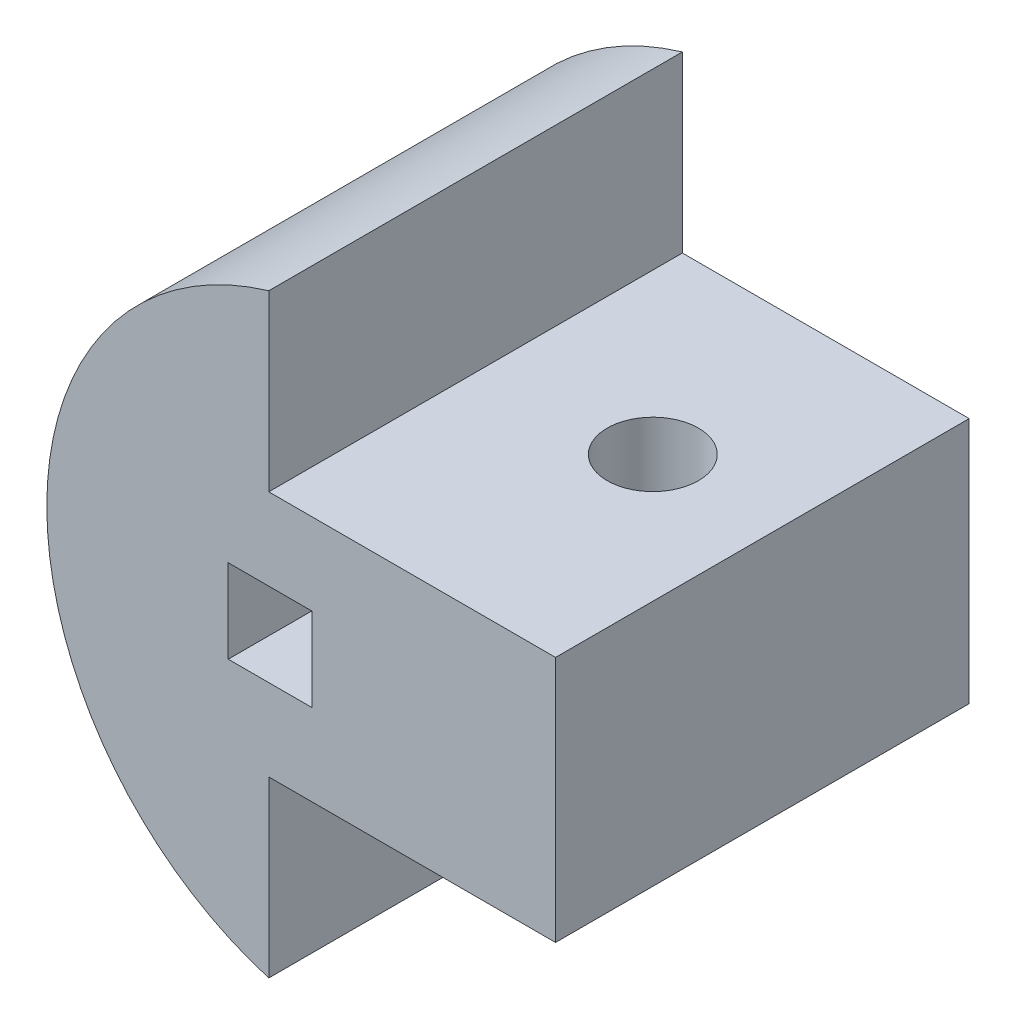
ISO-10303-21;
HEADER;
FILE_DESCRIPTION(('STEP AP214'),'2;1');
FILE_NAME('part.step','',(''),(''),'','','');
FILE_SCHEMA(('AUTOMOTIVE_DESIGN { 1 0 10303 214 1 1 1 1 }'));
ENDSEC;
DATA;
#1=APPLICATION_CONTEXT('core data for automotive mechanical design processes');
#2=APPLICATION_PROTOCOL_DEFINITION('international standard','automotive_design',2000,#1);
#3=PRODUCT_CONTEXT('',#1,'mechanical');
#4=PRODUCT('Part','Part','',(#3));
#5=PRODUCT_RELATED_PRODUCT_CATEGORY('part','',(#4));
#6=PRODUCT_DEFINITION_FORMATION('','',#4);
#7=PRODUCT_DEFINITION_CONTEXT('part definition',#1,'design');
#8=PRODUCT_DEFINITION('design','',#6,#7);
#9=PRODUCT_DEFINITION_SHAPE('','',#8);
#10=(LENGTH_UNIT() NAMED_UNIT(*) SI_UNIT(.MILLI.,.METRE.));
#11=(NAMED_UNIT(*) PLANE_ANGLE_UNIT() SI_UNIT($,.RADIAN.));
#12=(NAMED_UNIT(*) SI_UNIT($,.STERADIAN.) SOLID_ANGLE_UNIT());
#13=UNCERTAINTY_MEASURE_WITH_UNIT(LENGTH_MEASURE(1.E-05),#10,'distance_accuracy_value','');
#14=(GEOMETRIC_REPRESENTATION_CONTEXT(3) GLOBAL_UNCERTAINTY_ASSIGNED_CONTEXT((#13)) GLOBAL_UNIT_ASSIGNED_CONTEXT((#10,
#11,#12)) REPRESENTATION_CONTEXT('',''));
#15=CARTESIAN_POINT('',(0.,0.,0.));
#16=DIRECTION('',(0.,0.,1.));
#17=DIRECTION('',(1.,0.,0.));
#18=AXIS2_PLACEMENT_3D('',#15,#16,#17);
#19=CARTESIAN_POINT('',(1.675,0.,-47.9828540944257));
#20=DIRECTION('',(-1.,0.,0.));
#21=DIRECTION('',(0.,-1.,0.));
#22=AXIS2_PLACEMENT_3D('',#19,#20,#21);
#23=PLANE('',#22);
#24=DIRECTION('',(0.,0.,1.));
#25=VECTOR('',#24,1.);
#26=CARTESIAN_POINT('',(1.675,9.675,-47.9828540944257));
#27=LINE('',#26,#25);
#28=CARTESIAN_POINT('',(1.675,9.675,-16.5860389693211));
#29=VERTEX_POINT('',#28);
#30=CARTESIAN_POINT('',(1.675,9.675,0.));
#31=VERTEX_POINT('',#30);
#32=EDGE_CURVE('E141',#29,#31,#27,.T.);
#33=ORIENTED_EDGE('',*,*,#32,.F.);
#34=DIRECTION('',(0.,-1.,0.));
#35=VECTOR('',#34,1.);
#36=CARTESIAN_POINT('',(1.675,0.,-16.5860389693211));
#37=LINE('',#36,#35);
#38=CARTESIAN_POINT('',(1.675,6.325,-16.5860389693211));
#39=VERTEX_POINT('',#38);
#40=EDGE_CURVE('E122',#29,#39,#37,.T.);
#41=ORIENTED_EDGE('',*,*,#40,.T.);
#42=DIRECTION('',(0.,0.,1.));
#43=VECTOR('',#42,1.);
#44=CARTESIAN_POINT('',(1.675,6.325,-47.9828540944257));
#45=LINE('',#44,#43);
#46=CARTESIAN_POINT('',(1.675,6.325,0.));
#47=VERTEX_POINT('',#46);
#48=EDGE_CURVE('E139',#39,#47,#45,.T.);
#49=ORIENTED_EDGE('',*,*,#48,.T.);
#50=DIRECTION('',(0.,-1.,0.));
#51=VECTOR('',#50,1.);
#52=CARTESIAN_POINT('',(1.675,0.,0.));
#53=LINE('',#52,#51);
#54=EDGE_CURVE('E189',#31,#47,#53,.T.);
#55=ORIENTED_EDGE('',*,*,#54,.F.);
#56=EDGE_LOOP('',(#33,#41,#49,#55));
#57=FACE_BOUND('',#56,.T.);
#58=ADVANCED_FACE('F35',(#57),#23,.T.);
#59=CARTESIAN_POINT('',(0.,6.325,-47.9828540944257));
#60=DIRECTION('',(0.,-1.,0.));
#61=DIRECTION('',(0.,0.,-1.));
#62=AXIS2_PLACEMENT_3D('',#59,#60,#61);
#63=PLANE('',#62);
#64=DIRECTION('',(1.,0.,0.));
#65=VECTOR('',#64,1.);
#66=CARTESIAN_POINT('',(0.,6.325,-16.5860389693211));
#67=LINE('',#66,#65);
#68=CARTESIAN_POINT('',(-1.675,6.325,-16.5860389693211));
#69=VERTEX_POINT('',#68);
#70=EDGE_CURVE('E51',#69,#39,#67,.T.);
#71=ORIENTED_EDGE('',*,*,#70,.F.);
#72=DIRECTION('',(0.,0.,1.));
#73=VECTOR('',#72,1.);
#74=CARTESIAN_POINT('',(-1.675,6.325,-47.9828540944257));
#75=LINE('',#74,#73);
#76=CARTESIAN_POINT('',(-1.675,6.325,0.));
#77=VERTEX_POINT('',#76);
#78=EDGE_CURVE('E134',#69,#77,#75,.T.);
#79=ORIENTED_EDGE('',*,*,#78,.T.);
#80=DIRECTION('',(1.,0.,0.));
#81=VECTOR('',#80,1.);
#82=CARTESIAN_POINT('',(0.,6.325,0.));
#83=LINE('',#82,#81);
#84=EDGE_CURVE('E186',#77,#47,#83,.T.);
#85=ORIENTED_EDGE('',*,*,#84,.T.);
#86=ORIENTED_EDGE('',*,*,#48,.F.);
#87=EDGE_LOOP('',(#71,#79,#85,#86));
#88=FACE_BOUND('',#87,.T.);
#89=ADVANCED_FACE('F226',(#88),#63,.F.);
#90=CARTESIAN_POINT('',(-1.675,0.,-47.9828540944257));
#91=DIRECTION('',(-1.,0.,0.));
#92=DIRECTION('',(0.,-1.,0.));
#93=AXIS2_PLACEMENT_3D('',#90,#91,#92);
#94=PLANE('',#93);
#95=DIRECTION('',(0.,-1.,0.));
#96=VECTOR('',#95,1.);
#97=CARTESIAN_POINT('',(-1.675,0.,-16.5860389693211));
#98=LINE('',#97,#96);
#99=CARTESIAN_POINT('',(-1.675,9.675,-16.5860389693211));
#100=VERTEX_POINT('',#99);
#101=EDGE_CURVE('E197',#100,#69,#98,.T.);
#102=ORIENTED_EDGE('',*,*,#101,.F.);
#103=DIRECTION('',(0.,0.,1.));
#104=VECTOR('',#103,1.);
#105=CARTESIAN_POINT('',(-1.675,9.675,-47.9828540944257));
#106=LINE('',#105,#104);
#107=CARTESIAN_POINT('',(-1.675,9.675,0.));
#108=VERTEX_POINT('',#107);
#109=EDGE_CURVE('E130',#100,#108,#106,.T.);
#110=ORIENTED_EDGE('',*,*,#109,.T.);
#111=DIRECTION('',(0.,-1.,0.));
#112=VECTOR('',#111,1.);
#113=CARTESIAN_POINT('',(-1.675,0.,0.));
#114=LINE('',#113,#112);
#115=EDGE_CURVE('E183',#108,#77,#114,.T.);
#116=ORIENTED_EDGE('',*,*,#115,.T.);
#117=ORIENTED_EDGE('',*,*,#78,.F.);
#118=EDGE_LOOP('',(#102,#110,#116,#117));
#119=FACE_BOUND('',#118,.T.);
#120=ADVANCED_FACE('F231',(#119),#94,.F.);
#121=CARTESIAN_POINT('',(0.,9.675,-47.9828540944257));
#122=DIRECTION('',(0.,-1.,0.));
#123=DIRECTION('',(0.,0.,-1.));
#124=AXIS2_PLACEMENT_3D('',#121,#122,#123);
#125=PLANE('',#124);
#126=ORIENTED_EDGE('',*,*,#109,.F.);
#127=DIRECTION('',(1.,0.,0.));
#128=VECTOR('',#127,1.);
#129=CARTESIAN_POINT('',(0.,9.675,-16.5860389693211));
#130=LINE('',#129,#128);
#131=EDGE_CURVE('E195',#100,#29,#130,.T.);
#132=ORIENTED_EDGE('',*,*,#131,.T.);
#133=ORIENTED_EDGE('',*,*,#32,.T.);
#134=DIRECTION('',(1.,0.,0.));
#135=VECTOR('',#134,1.);
#136=CARTESIAN_POINT('',(0.,9.675,0.));
#137=LINE('',#136,#135);
#138=EDGE_CURVE('E192',#108,#31,#137,.T.);
#139=ORIENTED_EDGE('',*,*,#138,.F.);
#140=EDGE_LOOP('',(#126,#132,#133,#139));
#141=FACE_BOUND('',#140,.T.);
#142=ADVANCED_FACE('F37',(#141),#125,.T.);
#143=CARTESIAN_POINT('',(0.,0.,0.));
#144=DIRECTION('',(0.,0.,1.));
#145=DIRECTION('',(1.,0.,0.));
#146=AXIS2_PLACEMENT_3D('',#143,#144,#145);
#147=PLANE('',#146);
#148=ORIENTED_EDGE('',*,*,#138,.T.);
#149=ORIENTED_EDGE('',*,*,#54,.T.);
#150=ORIENTED_EDGE('',*,*,#84,.F.);
#151=ORIENTED_EDGE('',*,*,#115,.F.);
#152=EDGE_LOOP('',(#148,#149,#150,#151));
#153=FACE_BOUND('',#152,.T.);
#154=DIRECTION('',(0.,-1.,0.));
#155=VECTOR('',#154,1.);
#156=CARTESIAN_POINT('',(-0.0499999999999987,0.,0.));
#157=LINE('',#156,#155);
#158=CARTESIAN_POINT('',(-0.0500000000000001,19.933147112141,0.));
#159=VERTEX_POINT('',#158);
#160=CARTESIAN_POINT('',(-0.0499999999999996,12.95,0.));
#161=VERTEX_POINT('',#160);
#162=EDGE_CURVE('E179',#159,#161,#157,.T.);
#163=ORIENTED_EDGE('',*,*,#162,.F.);
#164=CARTESIAN_POINT('',(3.5,8.,0.));
#165=DIRECTION('',(0.,0.,1.));
#166=DIRECTION('',(1.,0.,0.));
#167=AXIS2_PLACEMENT_3D('',#164,#165,#166);
#168=CIRCLE('',#167,12.45);
#169=CARTESIAN_POINT('',(-0.0500000000000001,-3.93314711214104,0.));
#170=VERTEX_POINT('',#169);
#171=EDGE_CURVE('E128',#159,#170,#168,.T.);
#172=ORIENTED_EDGE('',*,*,#171,.T.);
#173=DIRECTION('',(0.,1.,0.));
#174=VECTOR('',#173,1.);
#175=CARTESIAN_POINT('',(-0.0500000000000001,0.,0.));
#176=LINE('',#175,#174);
#177=CARTESIAN_POINT('',(-0.05,3.05,0.));
#178=VERTEX_POINT('',#177);
#179=EDGE_CURVE('E169',#170,#178,#176,.T.);
#180=ORIENTED_EDGE('',*,*,#179,.T.);
#181=DIRECTION('',(1.,0.,0.));
#182=VECTOR('',#181,1.);
#183=CARTESIAN_POINT('',(0.,3.05,0.));
#184=LINE('',#183,#182);
#185=CARTESIAN_POINT('',(11.45,3.05,0.));
#186=VERTEX_POINT('',#185);
#187=EDGE_CURVE('E155',#178,#186,#184,.T.);
#188=ORIENTED_EDGE('',*,*,#187,.T.);
#189=DIRECTION('',(0.,1.,0.));
#190=VECTOR('',#189,1.);
#191=CARTESIAN_POINT('',(11.45,0.,0.));
#192=LINE('',#191,#190);
#193=CARTESIAN_POINT('',(11.45,12.95,0.));
#194=VERTEX_POINT('',#193);
#195=EDGE_CURVE('E149',#186,#194,#192,.T.);
#196=ORIENTED_EDGE('',*,*,#195,.T.);
#197=DIRECTION('',(1.,0.,0.));
#198=VECTOR('',#197,1.);
#199=CARTESIAN_POINT('',(0.,12.95,0.));
#200=LINE('',#199,#198);
#201=EDGE_CURVE('E142',#161,#194,#200,.T.);
#202=ORIENTED_EDGE('',*,*,#201,.F.);
#203=EDGE_LOOP('',(#163,#172,#180,#188,#196,#202));
#204=FACE_BOUND('',#203,.T.);
#205=ADVANCED_FACE('F177',(#153,#204),#147,.T.);
#206=CARTESIAN_POINT('',(3.5,8.,-47.9828540944257));
#207=DIRECTION('',(0.,0.,1.));
#208=DIRECTION('',(1.,0.,0.));
#209=AXIS2_PLACEMENT_3D('',#206,#207,#208);
#210=CYLINDRICAL_SURFACE('',#209,12.45);
#211=DIRECTION('',(0.,0.,1.));
#212=VECTOR('',#211,1.);
#213=CARTESIAN_POINT('',(-0.0500000000000001,19.933147112141,-47.9828540944257));
#214=LINE('',#213,#212);
#215=CARTESIAN_POINT('',(-0.0500000000000001,19.933147112141,-16.5860389693211));
#216=VERTEX_POINT('',#215);
#217=EDGE_CURVE('E119',#216,#159,#214,.T.);
#218=ORIENTED_EDGE('',*,*,#217,.F.);
#219=CARTESIAN_POINT('',(3.5,8.,-16.5860389693211));
#220=DIRECTION('',(0.,0.,-1.));
#221=DIRECTION('',(-1.,0.,0.));
#222=AXIS2_PLACEMENT_3D('',#219,#220,#221);
#223=CIRCLE('',#222,12.45);
#224=CARTESIAN_POINT('',(-0.0500000000000001,-3.93314711214104,-16.5860389693211));
#225=VERTEX_POINT('',#224);
#226=EDGE_CURVE('E11',#216,#225,#223,.F.);
#227=ORIENTED_EDGE('',*,*,#226,.T.);
#228=DIRECTION('',(0.,0.,1.));
#229=VECTOR('',#228,1.);
#230=CARTESIAN_POINT('',(-0.0500000000000001,-3.93314711214104,-47.9828540944257));
#231=LINE('',#230,#229);
#232=EDGE_CURVE('E129',#225,#170,#231,.T.);
#233=ORIENTED_EDGE('',*,*,#232,.T.);
#234=ORIENTED_EDGE('',*,*,#171,.F.);
#235=EDGE_LOOP('',(#218,#227,#233,#234));
#236=FACE_BOUND('',#235,.T.);
#237=ADVANCED_FACE('F126',(#236),#210,.T.);
#238=CARTESIAN_POINT('',(-0.0500000000000001,0.,-47.9828540944257));
#239=DIRECTION('',(1.,0.,0.));
#240=DIRECTION('',(0.,1.,0.));
#241=AXIS2_PLACEMENT_3D('',#238,#239,#240);
#242=PLANE('',#241);
#243=ORIENTED_EDGE('',*,*,#232,.F.);
#244=DIRECTION('',(0.,1.,0.));
#245=VECTOR('',#244,1.);
#246=CARTESIAN_POINT('',(-0.0500000000000001,0.,-16.5860389693211));
#247=LINE('',#246,#245);
#248=CARTESIAN_POINT('',(-0.05,3.05,-16.5860389693211));
#249=VERTEX_POINT('',#248);
#250=EDGE_CURVE('E59',#225,#249,#247,.T.);
#251=ORIENTED_EDGE('',*,*,#250,.T.);
#252=DIRECTION('',(0.,0.,1.));
#253=VECTOR('',#252,1.);
#254=CARTESIAN_POINT('',(-0.05,3.05,-47.9828540944257));
#255=LINE('',#254,#253);
#256=EDGE_CURVE('E132',#249,#178,#255,.T.);
#257=ORIENTED_EDGE('',*,*,#256,.T.);
#258=ORIENTED_EDGE('',*,*,#179,.F.);
#259=EDGE_LOOP('',(#243,#251,#257,#258));
#260=FACE_BOUND('',#259,.T.);
#261=ADVANCED_FACE('F167',(#260),#242,.T.);
#262=CARTESIAN_POINT('',(0.,3.05,-47.9828540944257));
#263=DIRECTION('',(0.,-1.,0.));
#264=DIRECTION('',(1.,0.,0.));
#265=AXIS2_PLACEMENT_3D('',#262,#263,#264);
#266=PLANE('',#265);
#267=CARTESIAN_POINT('',(6.35,3.05,-8.99999999999999));
#268=DIRECTION('',(0.,-1.,0.));
#269=DIRECTION('',(1.,0.,0.));
#270=AXIS2_PLACEMENT_3D('',#267,#268,#269);
#271=CIRCLE('',#270,1.8288);
#272=CARTESIAN_POINT('',(8.1788,3.05,-8.99999999999999));
#273=VERTEX_POINT('',#272);
#274=EDGE_CURVE('E209',#273,#273,#271,.T.);
#275=ORIENTED_EDGE('',*,*,#274,.F.);
#276=EDGE_LOOP('',(#275));
#277=FACE_BOUND('',#276,.T.);
#278=ORIENTED_EDGE('',*,*,#256,.F.);
#279=DIRECTION('',(1.,0.,0.));
#280=VECTOR('',#279,1.);
#281=CARTESIAN_POINT('',(0.,3.05,-16.5860389693211));
#282=LINE('',#281,#280);
#283=CARTESIAN_POINT('',(11.45,3.05,-16.5860389693211));
#284=VERTEX_POINT('',#283);
#285=EDGE_CURVE('E206',#249,#284,#282,.T.);
#286=ORIENTED_EDGE('',*,*,#285,.T.);
#287=DIRECTION('',(0.,0.,1.));
#288=VECTOR('',#287,1.);
#289=CARTESIAN_POINT('',(11.45,3.05,-47.9828540944257));
#290=LINE('',#289,#288);
#291=EDGE_CURVE('E162',#284,#186,#290,.T.);
#292=ORIENTED_EDGE('',*,*,#291,.T.);
#293=ORIENTED_EDGE('',*,*,#187,.F.);
#294=EDGE_LOOP('',(#278,#286,#292,#293));
#295=FACE_BOUND('',#294,.T.);
#296=ADVANCED_FACE('F173',(#277,#295),#266,.T.);
#297=CARTESIAN_POINT('',(11.45,0.,-47.9828540944257));
#298=DIRECTION('',(1.,0.,0.));
#299=DIRECTION('',(0.,1.,0.));
#300=AXIS2_PLACEMENT_3D('',#297,#298,#299);
#301=PLANE('',#300);
#302=ORIENTED_EDGE('',*,*,#291,.F.);
#303=DIRECTION('',(0.,1.,0.));
#304=VECTOR('',#303,1.);
#305=CARTESIAN_POINT('',(11.45,0.,-16.5860389693211));
#306=LINE('',#305,#304);
#307=CARTESIAN_POINT('',(11.45,12.95,-16.5860389693211));
#308=VERTEX_POINT('',#307);
#309=EDGE_CURVE('E203',#284,#308,#306,.T.);
#310=ORIENTED_EDGE('',*,*,#309,.T.);
#311=DIRECTION('',(0.,0.,1.));
#312=VECTOR('',#311,1.);
#313=CARTESIAN_POINT('',(11.45,12.95,-47.9828540944257));
#314=LINE('',#313,#312);
#315=EDGE_CURVE('E160',#308,#194,#314,.T.);
#316=ORIENTED_EDGE('',*,*,#315,.T.);
#317=ORIENTED_EDGE('',*,*,#195,.F.);
#318=EDGE_LOOP('',(#302,#310,#316,#317));
#319=FACE_BOUND('',#318,.T.);
#320=ADVANCED_FACE('F246',(#319),#301,.T.);
#321=CARTESIAN_POINT('',(0.,12.95,-47.9828540944257));
#322=DIRECTION('',(0.,-1.,0.));
#323=DIRECTION('',(1.,0.,0.));
#324=AXIS2_PLACEMENT_3D('',#321,#322,#323);
#325=PLANE('',#324);
#326=CARTESIAN_POINT('',(6.35,12.95,-8.99999999999999));
#327=DIRECTION('',(0.,-1.,0.));
#328=DIRECTION('',(1.,0.,0.));
#329=AXIS2_PLACEMENT_3D('',#326,#327,#328);
#330=CIRCLE('',#329,1.8288);
#331=CARTESIAN_POINT('',(8.1788,12.95,-8.99999999999999));
#332=VERTEX_POINT('',#331);
#333=EDGE_CURVE('E39',#332,#332,#330,.T.);
#334=ORIENTED_EDGE('',*,*,#333,.T.);
#335=EDGE_LOOP('',(#334));
#336=FACE_BOUND('',#335,.T.);
#337=DIRECTION('',(1.,0.,0.));
#338=VECTOR('',#337,1.);
#339=CARTESIAN_POINT('',(0.,12.95,-16.5860389693211));
#340=LINE('',#339,#338);
#341=CARTESIAN_POINT('',(-0.0499999999999996,12.95,-16.5860389693211));
#342=VERTEX_POINT('',#341);
#343=EDGE_CURVE('E123',#342,#308,#340,.T.);
#344=ORIENTED_EDGE('',*,*,#343,.F.);
#345=DIRECTION('',(0.,0.,1.));
#346=VECTOR('',#345,1.);
#347=CARTESIAN_POINT('',(-0.0499999999999996,12.95,-47.9828540944257));
#348=LINE('',#347,#346);
#349=EDGE_CURVE('E44',#342,#161,#348,.T.);
#350=ORIENTED_EDGE('',*,*,#349,.T.);
#351=ORIENTED_EDGE('',*,*,#201,.T.);
#352=ORIENTED_EDGE('',*,*,#315,.F.);
#353=EDGE_LOOP('',(#344,#350,#351,#352));
#354=FACE_BOUND('',#353,.T.);
#355=ADVANCED_FACE('F216',(#336,#354),#325,.F.);
#356=CARTESIAN_POINT('',(-0.0499999999999987,0.,-47.9828540944257));
#357=DIRECTION('',(-1.,0.,0.));
#358=DIRECTION('',(0.,-1.,0.));
#359=AXIS2_PLACEMENT_3D('',#356,#357,#358);
#360=PLANE('',#359);
#361=DIRECTION('',(0.,-1.,0.));
#362=VECTOR('',#361,1.);
#363=CARTESIAN_POINT('',(-0.0499999999999987,0.,-16.5860389693211));
#364=LINE('',#363,#362);
#365=EDGE_CURVE('E112',#216,#342,#364,.T.);
#366=ORIENTED_EDGE('',*,*,#365,.F.);
#367=ORIENTED_EDGE('',*,*,#217,.T.);
#368=ORIENTED_EDGE('',*,*,#162,.T.);
#369=ORIENTED_EDGE('',*,*,#349,.F.);
#370=EDGE_LOOP('',(#366,#367,#368,#369));
#371=FACE_BOUND('',#370,.T.);
#372=ADVANCED_FACE('F117',(#371),#360,.F.);
#373=CARTESIAN_POINT('',(0.,-35.9004555785017,-16.5860389693211));
#374=DIRECTION('',(0.,0.,-1.));
#375=DIRECTION('',(1.,0.,0.));
#376=AXIS2_PLACEMENT_3D('',#373,#374,#375);
#377=PLANE('',#376);
#378=ORIENTED_EDGE('',*,*,#131,.F.);
#379=ORIENTED_EDGE('',*,*,#101,.T.);
#380=ORIENTED_EDGE('',*,*,#70,.T.);
#381=ORIENTED_EDGE('',*,*,#40,.F.);
#382=EDGE_LOOP('',(#378,#379,#380,#381));
#383=FACE_BOUND('',#382,.T.);
#384=ORIENTED_EDGE('',*,*,#226,.F.);
#385=ORIENTED_EDGE('',*,*,#365,.T.);
#386=ORIENTED_EDGE('',*,*,#343,.T.);
#387=ORIENTED_EDGE('',*,*,#309,.F.);
#388=ORIENTED_EDGE('',*,*,#285,.F.);
#389=ORIENTED_EDGE('',*,*,#250,.F.);
#390=EDGE_LOOP('',(#384,#385,#386,#387,#388,#389));
#391=FACE_BOUND('',#390,.T.);
#392=ADVANCED_FACE('F111',(#383,#391),#377,.T.);
#393=CARTESIAN_POINT('',(6.35,19.933147112141,-8.99999999999999));
#394=DIRECTION('',(0.,-1.,0.));
#395=DIRECTION('',(1.,0.,0.));
#396=AXIS2_PLACEMENT_3D('',#393,#394,#395);
#397=CYLINDRICAL_SURFACE('',#396,1.8288);
#398=ORIENTED_EDGE('',*,*,#274,.T.);
#399=EDGE_LOOP('',(#398));
#400=FACE_BOUND('',#399,.T.);
#401=ORIENTED_EDGE('',*,*,#333,.F.);
#402=EDGE_LOOP('',(#401));
#403=FACE_BOUND('',#402,.T.);
#404=ADVANCED_FACE('F218',(#400,#403),#397,.F.);
#405=CLOSED_SHELL('',(#58,#89,#120,#142,#205,#237,#261,#296,#320,#355,#372,#392,#404));
#406=MANIFOLD_SOLID_BREP('B2',#405);
#407=ADVANCED_BREP_SHAPE_REPRESENTATION('',(#18,#406),#14);
#408=SHAPE_DEFINITION_REPRESENTATION(#9,#407);
ENDSEC;
END-ISO-10303-21;
